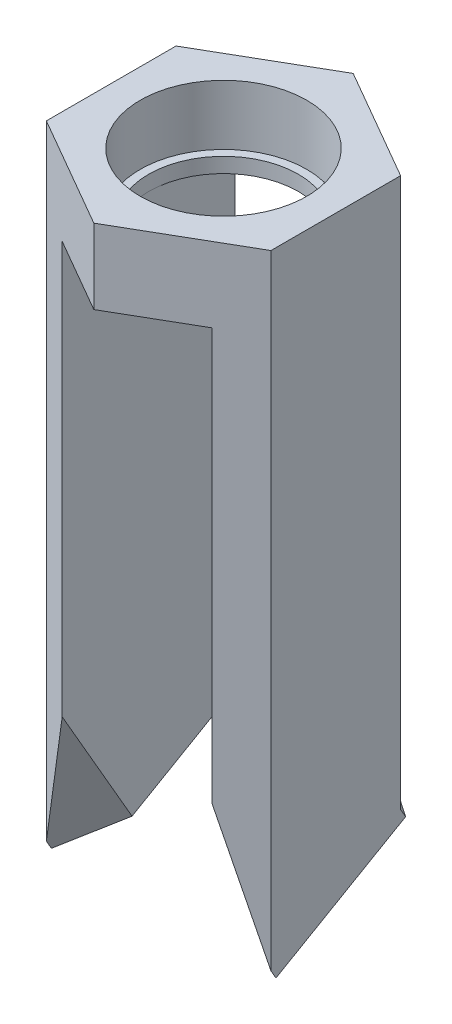
ISO-10303-21;
HEADER;
FILE_DESCRIPTION(('STEP AP214'),'2;1');
FILE_NAME('part.step','',(''),(''),'','','');
FILE_SCHEMA(('AUTOMOTIVE_DESIGN { 1 0 10303 214 1 1 1 1 }'));
ENDSEC;
DATA;
#1=APPLICATION_CONTEXT('core data for automotive mechanical design processes');
#2=APPLICATION_PROTOCOL_DEFINITION('international standard','automotive_design',2000,#1);
#3=PRODUCT_CONTEXT('',#1,'mechanical');
#4=PRODUCT('Part','Part','',(#3));
#5=PRODUCT_RELATED_PRODUCT_CATEGORY('part','',(#4));
#6=PRODUCT_DEFINITION_FORMATION('','',#4);
#7=PRODUCT_DEFINITION_CONTEXT('part definition',#1,'design');
#8=PRODUCT_DEFINITION('design','',#6,#7);
#9=PRODUCT_DEFINITION_SHAPE('','',#8);
#10=(LENGTH_UNIT() NAMED_UNIT(*) SI_UNIT(.MILLI.,.METRE.));
#11=(NAMED_UNIT(*) PLANE_ANGLE_UNIT() SI_UNIT($,.RADIAN.));
#12=(NAMED_UNIT(*) SI_UNIT($,.STERADIAN.) SOLID_ANGLE_UNIT());
#13=UNCERTAINTY_MEASURE_WITH_UNIT(LENGTH_MEASURE(1.E-05),#10,'distance_accuracy_value','');
#14=(GEOMETRIC_REPRESENTATION_CONTEXT(3) GLOBAL_UNCERTAINTY_ASSIGNED_CONTEXT((#13)) GLOBAL_UNIT_ASSIGNED_CONTEXT((#10,
#11,#12)) REPRESENTATION_CONTEXT('',''));
#15=CARTESIAN_POINT('',(0.,0.,0.));
#16=DIRECTION('',(0.,0.,1.));
#17=DIRECTION('',(1.,0.,0.));
#18=AXIS2_PLACEMENT_3D('',#15,#16,#17);
#19=CARTESIAN_POINT('',(0.,-2.,0.));
#20=DIRECTION('',(0.,-1.,0.));
#21=DIRECTION('',(0.,0.,-1.));
#22=AXIS2_PLACEMENT_3D('',#19,#20,#21);
#23=PLANE('',#22);
#24=DIRECTION('',(0.,0.,1.));
#25=VECTOR('',#24,1.);
#26=CARTESIAN_POINT('',(-10.,-2.,-11.5470053837926));
#27=LINE('',#26,#25);
#28=CARTESIAN_POINT('',(-10.,-2.,-11.5470053837926));
#29=VERTEX_POINT('',#28);
#30=CARTESIAN_POINT('',(-10.,-2.,0.));
#31=VERTEX_POINT('',#30);
#32=EDGE_CURVE('E56',#29,#31,#27,.T.);
#33=ORIENTED_EDGE('',*,*,#32,.F.);
#34=DIRECTION('',(0.866025403784439,0.,-0.5));
#35=VECTOR('',#34,1.);
#36=CARTESIAN_POINT('',(-15.0000000000001,-2.,-8.66025403784444));
#37=LINE('',#36,#35);
#38=CARTESIAN_POINT('',(0.,-2.,-17.3205080756889));
#39=VERTEX_POINT('',#38);
#40=EDGE_CURVE('E260',#29,#39,#37,.T.);
#41=ORIENTED_EDGE('',*,*,#40,.T.);
#42=DIRECTION('',(0.866025403784438,0.,0.5));
#43=VECTOR('',#42,1.);
#44=CARTESIAN_POINT('',(0.,-2.,-17.3205080756889));
#45=LINE('',#44,#43);
#46=CARTESIAN_POINT('',(10.,-2.,-11.5470053837926));
#47=VERTEX_POINT('',#46);
#48=EDGE_CURVE('E263',#39,#47,#45,.T.);
#49=ORIENTED_EDGE('',*,*,#48,.T.);
#50=DIRECTION('',(0.,0.,-1.));
#51=VECTOR('',#50,1.);
#52=CARTESIAN_POINT('',(10.,-2.,11.5470053837926));
#53=LINE('',#52,#51);
#54=CARTESIAN_POINT('',(10.,-2.,0.));
#55=VERTEX_POINT('',#54);
#56=EDGE_CURVE('E54',#55,#47,#53,.T.);
#57=ORIENTED_EDGE('',*,*,#56,.F.);
#58=CARTESIAN_POINT('',(0.,-2.,0.));
#59=DIRECTION('',(0.,-1.,0.));
#60=DIRECTION('',(0.,0.,-1.));
#61=AXIS2_PLACEMENT_3D('',#58,#59,#60);
#62=CIRCLE('',#61,10.);
#63=EDGE_CURVE('E251',#31,#55,#62,.T.);
#64=ORIENTED_EDGE('',*,*,#63,.F.);
#65=EDGE_LOOP('',(#33,#41,#49,#57,#64));
#66=FACE_BOUND('',#65,.T.);
#67=ADVANCED_FACE('F44',(#66),#23,.T.);
#68=CARTESIAN_POINT('',(0.,8.,0.));
#69=DIRECTION('',(0.,1.,0.));
#70=DIRECTION('',(0.,0.,1.));
#71=AXIS2_PLACEMENT_3D('',#68,#69,#70);
#72=PLANE('',#71);
#73=DIRECTION('',(-0.866025403784441,0.,-0.499999999999995));
#74=VECTOR('',#73,1.);
#75=CARTESIAN_POINT('',(14.9999999999999,8.,-8.66025403784456));
#76=LINE('',#75,#74);
#77=CARTESIAN_POINT('',(14.9999999999999,8.,-8.66025403784456));
#78=VERTEX_POINT('',#77);
#79=CARTESIAN_POINT('',(0.,8.,-17.3205080756888));
#80=VERTEX_POINT('',#79);
#81=EDGE_CURVE('E272',#78,#80,#76,.T.);
#82=ORIENTED_EDGE('',*,*,#81,.T.);
#83=DIRECTION('',(-0.866025403784438,0.,0.500000000000001));
#84=VECTOR('',#83,1.);
#85=CARTESIAN_POINT('',(0.,8.,-17.3205080756888));
#86=LINE('',#85,#84);
#87=CARTESIAN_POINT('',(-15.,8.,-8.66025403784436));
#88=VERTEX_POINT('',#87);
#89=EDGE_CURVE('E279',#80,#88,#86,.T.);
#90=ORIENTED_EDGE('',*,*,#89,.T.);
#91=DIRECTION('',(0.,0.,1.));
#92=VECTOR('',#91,1.);
#93=CARTESIAN_POINT('',(-15.,8.,-8.66025403784436));
#94=LINE('',#93,#92);
#95=CARTESIAN_POINT('',(-15.,8.,8.66025403784446));
#96=VERTEX_POINT('',#95);
#97=EDGE_CURVE('E282',#88,#96,#94,.T.);
#98=ORIENTED_EDGE('',*,*,#97,.T.);
#99=DIRECTION('',(0.866025403784442,0.,0.499999999999995));
#100=VECTOR('',#99,1.);
#101=CARTESIAN_POINT('',(-15.,8.,8.66025403784446));
#102=LINE('',#101,#100);
#103=CARTESIAN_POINT('',(1.20948461451098E-13,8.,17.3205080756888));
#104=VERTEX_POINT('',#103);
#105=EDGE_CURVE('E285',#96,#104,#102,.T.);
#106=ORIENTED_EDGE('',*,*,#105,.T.);
#107=DIRECTION('',(0.866025403784435,0.,-0.500000000000007));
#108=VECTOR('',#107,1.);
#109=CARTESIAN_POINT('',(1.20948461451098E-13,8.,17.3205080756888));
#110=LINE('',#109,#108);
#111=CARTESIAN_POINT('',(15.0000000000001,8.,8.66025403784425));
#112=VERTEX_POINT('',#111);
#113=EDGE_CURVE('E288',#104,#112,#110,.T.);
#114=ORIENTED_EDGE('',*,*,#113,.T.);
#115=DIRECTION('',(0.,0.,-1.));
#116=VECTOR('',#115,1.);
#117=CARTESIAN_POINT('',(15.0000000000001,8.,8.66025403784425));
#118=LINE('',#117,#116);
#119=EDGE_CURVE('E291',#112,#78,#118,.T.);
#120=ORIENTED_EDGE('',*,*,#119,.T.);
#121=EDGE_LOOP('',(#82,#90,#98,#106,#114,#120));
#122=FACE_BOUND('',#121,.T.);
#123=CARTESIAN_POINT('',(0.,8.,0.));
#124=DIRECTION('',(0.,1.,0.));
#125=DIRECTION('',(0.,0.,1.));
#126=AXIS2_PLACEMENT_3D('',#123,#124,#125);
#127=CIRCLE('',#126,11.125);
#128=CARTESIAN_POINT('',(0.,8.,11.125));
#129=VERTEX_POINT('',#128);
#130=EDGE_CURVE('E268',#129,#129,#127,.T.);
#131=ORIENTED_EDGE('',*,*,#130,.F.);
#132=EDGE_LOOP('',(#131));
#133=FACE_BOUND('',#132,.T.);
#134=ADVANCED_FACE('F357',(#122,#133),#72,.T.);
#135=CARTESIAN_POINT('',(14.9999999999999,8.,-8.66025403784456));
#136=DIRECTION('',(-0.499999999999995,0.,0.866025403784441));
#137=DIRECTION('',(0.866025403784442,0.,0.499999999999995));
#138=AXIS2_PLACEMENT_3D('',#135,#136,#137);
#139=PLANE('',#138);
#140=DIRECTION('',(0.,-1.,0.));
#141=VECTOR('',#140,1.);
#142=CARTESIAN_POINT('',(14.9999999999999,8.,-8.66025403784456));
#143=LINE('',#142,#141);
#144=CARTESIAN_POINT('',(15.0000000000001,-65.3333333333335,-8.66025403784456));
#145=VERTEX_POINT('',#144);
#146=EDGE_CURVE('E294',#78,#145,#143,.T.);
#147=ORIENTED_EDGE('',*,*,#146,.T.);
#148=DIRECTION('',(-0.832050294337848,0.277350098112608,-0.480384461415258));
#149=VECTOR('',#148,1.);
#150=CARTESIAN_POINT('',(-1.92307692307671,-59.6923076923081,-18.4307970548995));
#151=LINE('',#150,#149);
#152=CARTESIAN_POINT('',(10.,-63.6666666666669,-11.5470053837927));
#153=VERTEX_POINT('',#152);
#154=EDGE_CURVE('E224',#145,#153,#151,.T.);
#155=ORIENTED_EDGE('',*,*,#154,.T.);
#156=DIRECTION('',(0.,1.,0.));
#157=VECTOR('',#156,1.);
#158=CARTESIAN_POINT('',(10.,-77.,-11.5470053837926));
#159=LINE('',#158,#157);
#160=EDGE_CURVE('E240',#153,#47,#159,.T.);
#161=ORIENTED_EDGE('',*,*,#160,.T.);
#162=ORIENTED_EDGE('',*,*,#48,.F.);
#163=DIRECTION('',(0.,-1.,0.));
#164=VECTOR('',#163,1.);
#165=CARTESIAN_POINT('',(0.,8.,-17.3205080756888));
#166=LINE('',#165,#164);
#167=EDGE_CURVE('E48',#80,#39,#166,.T.);
#168=ORIENTED_EDGE('',*,*,#167,.F.);
#169=ORIENTED_EDGE('',*,*,#81,.F.);
#170=EDGE_LOOP('',(#147,#155,#161,#162,#168,#169));
#171=FACE_BOUND('',#170,.T.);
#172=ADVANCED_FACE('F46',(#171),#139,.F.);
#173=CARTESIAN_POINT('',(0.,8.,-17.3205080756888));
#174=DIRECTION('',(0.500000000000001,0.,0.866025403784438));
#175=DIRECTION('',(0.866025403784438,0.,-0.500000000000001));
#176=AXIS2_PLACEMENT_3D('',#173,#174,#175);
#177=PLANE('',#176);
#178=DIRECTION('',(0.,1.,0.));
#179=VECTOR('',#178,1.);
#180=CARTESIAN_POINT('',(-10.,-77.,-11.5470053837926));
#181=LINE('',#180,#179);
#182=CARTESIAN_POINT('',(-10.,-63.6666666666669,-11.5470053837926));
#183=VERTEX_POINT('',#182);
#184=EDGE_CURVE('E234',#183,#29,#181,.T.);
#185=ORIENTED_EDGE('',*,*,#184,.F.);
#186=DIRECTION('',(-0.832050294337845,-0.277350098112608,0.480384461415263));
#187=VECTOR('',#186,1.);
#188=CARTESIAN_POINT('',(15.7692307692305,-55.0769230769237,-26.4248777052173));
#189=LINE('',#188,#187);
#190=CARTESIAN_POINT('',(-15.,-65.3333333333335,-8.66025403784445));
#191=VERTEX_POINT('',#190);
#192=EDGE_CURVE('E204',#183,#191,#189,.T.);
#193=ORIENTED_EDGE('',*,*,#192,.T.);
#194=DIRECTION('',(0.,-1.,0.));
#195=VECTOR('',#194,1.);
#196=CARTESIAN_POINT('',(-15.,8.,-8.66025403784436));
#197=LINE('',#196,#195);
#198=EDGE_CURVE('E309',#88,#191,#197,.T.);
#199=ORIENTED_EDGE('',*,*,#198,.F.);
#200=ORIENTED_EDGE('',*,*,#89,.F.);
#201=ORIENTED_EDGE('',*,*,#167,.T.);
#202=ORIENTED_EDGE('',*,*,#40,.F.);
#203=EDGE_LOOP('',(#185,#193,#199,#200,#201,#202));
#204=FACE_BOUND('',#203,.T.);
#205=ADVANCED_FACE('F351',(#204),#177,.F.);
#206=CARTESIAN_POINT('',(-15.,8.,-8.66025403784436));
#207=DIRECTION('',(1.,0.,0.));
#208=DIRECTION('',(0.,0.,-1.));
#209=AXIS2_PLACEMENT_3D('',#206,#207,#208);
#210=PLANE('',#209);
#211=ORIENTED_EDGE('',*,*,#198,.T.);
#212=DIRECTION('',(0.,0.866025403784444,0.499999999999991));
#213=VECTOR('',#212,1.);
#214=CARTESIAN_POINT('',(-15.,-66.4938073744047,-9.33025403784444));
#215=LINE('',#214,#213);
#216=CARTESIAN_POINT('',(-15.,-66.4938073744047,-9.33025403784444));
#217=VERTEX_POINT('',#216);
#218=EDGE_CURVE('E199',#217,#191,#215,.T.);
#219=ORIENTED_EDGE('',*,*,#218,.F.);
#220=DIRECTION('',(0.,0.499999999999991,-0.866025403784444));
#221=VECTOR('',#220,1.);
#222=CARTESIAN_POINT('',(-15.,-76.4938073744045,7.99025403784447));
#223=LINE('',#222,#221);
#224=CARTESIAN_POINT('',(-15.,-76.4938073744045,7.99025403784447));
#225=VERTEX_POINT('',#224);
#226=EDGE_CURVE('E182',#225,#217,#223,.T.);
#227=ORIENTED_EDGE('',*,*,#226,.F.);
#228=DIRECTION('',(0.,0.866025403784444,0.499999999999991));
#229=VECTOR('',#228,1.);
#230=CARTESIAN_POINT('',(-15.,-76.4938073744045,7.99025403784447));
#231=LINE('',#230,#229);
#232=CARTESIAN_POINT('',(-15.,-75.3333333333334,8.66025403784447));
#233=VERTEX_POINT('',#232);
#234=EDGE_CURVE('E160',#225,#233,#231,.T.);
#235=ORIENTED_EDGE('',*,*,#234,.T.);
#236=DIRECTION('',(0.,-1.,0.));
#237=VECTOR('',#236,1.);
#238=CARTESIAN_POINT('',(-15.,8.,8.66025403784446));
#239=LINE('',#238,#237);
#240=EDGE_CURVE('E306',#96,#233,#239,.T.);
#241=ORIENTED_EDGE('',*,*,#240,.F.);
#242=ORIENTED_EDGE('',*,*,#97,.F.);
#243=EDGE_LOOP('',(#211,#219,#227,#235,#241,#242));
#244=FACE_BOUND('',#243,.T.);
#245=ADVANCED_FACE('F354',(#244),#210,.F.);
#246=CARTESIAN_POINT('',(-15.,8.,8.66025403784446));
#247=DIRECTION('',(0.499999999999995,0.,-0.866025403784442));
#248=DIRECTION('',(-0.866025403784442,0.,-0.499999999999995));
#249=AXIS2_PLACEMENT_3D('',#246,#247,#248);
#250=PLANE('',#249);
#251=ORIENTED_EDGE('',*,*,#240,.T.);
#252=DIRECTION('',(0.260132990857232,0.953820966476534,0.150187852296523));
#253=VECTOR('',#252,1.);
#254=CARTESIAN_POINT('',(5.67669172932306,0.481203007519083,20.5979475737199));
#255=LINE('',#254,#253);
#256=CARTESIAN_POINT('',(-10.,-56.9999999999997,11.5470053837926));
#257=VERTEX_POINT('',#256);
#258=EDGE_CURVE('E175',#233,#257,#255,.T.);
#259=ORIENTED_EDGE('',*,*,#258,.T.);
#260=DIRECTION('',(0.,1.,0.));
#261=VECTOR('',#260,1.);
#262=CARTESIAN_POINT('',(-10.,-77.,11.5470053837926));
#263=LINE('',#262,#261);
#264=CARTESIAN_POINT('',(-10.,-2.,11.5470053837926));
#265=VERTEX_POINT('',#264);
#266=EDGE_CURVE('E173',#257,#265,#263,.T.);
#267=ORIENTED_EDGE('',*,*,#266,.T.);
#268=DIRECTION('',(-0.866025403784439,0.,-0.5));
#269=VECTOR('',#268,1.);
#270=CARTESIAN_POINT('',(0.,-2.,17.3205080756889));
#271=LINE('',#270,#269);
#272=CARTESIAN_POINT('',(0.,-2.,17.3205080756889));
#273=VERTEX_POINT('',#272);
#274=EDGE_CURVE('E257',#273,#265,#271,.T.);
#275=ORIENTED_EDGE('',*,*,#274,.F.);
#276=DIRECTION('',(0.,-1.,0.));
#277=VECTOR('',#276,1.);
#278=CARTESIAN_POINT('',(1.20948461451098E-13,8.,17.3205080756888));
#279=LINE('',#278,#277);
#280=EDGE_CURVE('E302',#104,#273,#279,.T.);
#281=ORIENTED_EDGE('',*,*,#280,.F.);
#282=ORIENTED_EDGE('',*,*,#105,.F.);
#283=EDGE_LOOP('',(#251,#259,#267,#275,#281,#282));
#284=FACE_BOUND('',#283,.T.);
#285=ADVANCED_FACE('F349',(#284),#250,.F.);
#286=CARTESIAN_POINT('',(1.20948461451098E-13,8.,17.3205080756888));
#287=DIRECTION('',(-0.500000000000007,0.,-0.866025403784434));
#288=DIRECTION('',(-0.866025403784435,0.,0.500000000000007));
#289=AXIS2_PLACEMENT_3D('',#286,#287,#288);
#290=PLANE('',#289);
#291=DIRECTION('',(0.,1.,0.));
#292=VECTOR('',#291,1.);
#293=CARTESIAN_POINT('',(10.,-77.,11.5470053837926));
#294=LINE('',#293,#292);
#295=CARTESIAN_POINT('',(10.,-56.9999999999997,11.5470053837926));
#296=VERTEX_POINT('',#295);
#297=CARTESIAN_POINT('',(10.,-2.,11.5470053837926));
#298=VERTEX_POINT('',#297);
#299=EDGE_CURVE('E227',#296,#298,#294,.T.);
#300=ORIENTED_EDGE('',*,*,#299,.F.);
#301=DIRECTION('',(0.260132990857236,-0.953820966476531,-0.150187852296531));
#302=VECTOR('',#301,1.);
#303=CARTESIAN_POINT('',(-7.03007518796991,5.44360902255633,21.3793238778867));
#304=LINE('',#303,#302);
#305=CARTESIAN_POINT('',(15.0000000000002,-75.3333333333334,8.66025403784445));
#306=VERTEX_POINT('',#305);
#307=EDGE_CURVE('E191',#296,#306,#304,.T.);
#308=ORIENTED_EDGE('',*,*,#307,.T.);
#309=DIRECTION('',(0.,-1.,0.));
#310=VECTOR('',#309,1.);
#311=CARTESIAN_POINT('',(15.0000000000001,8.,8.66025403784425));
#312=LINE('',#311,#310);
#313=EDGE_CURVE('E298',#112,#306,#312,.T.);
#314=ORIENTED_EDGE('',*,*,#313,.F.);
#315=ORIENTED_EDGE('',*,*,#113,.F.);
#316=ORIENTED_EDGE('',*,*,#280,.T.);
#317=DIRECTION('',(-0.866025403784439,0.,0.5));
#318=VECTOR('',#317,1.);
#319=CARTESIAN_POINT('',(15.0000000000001,-2.,8.66025403784445));
#320=LINE('',#319,#318);
#321=EDGE_CURVE('E250',#298,#273,#320,.T.);
#322=ORIENTED_EDGE('',*,*,#321,.F.);
#323=EDGE_LOOP('',(#300,#308,#314,#315,#316,#322));
#324=FACE_BOUND('',#323,.T.);
#325=ADVANCED_FACE('F341',(#324),#290,.F.);
#326=CARTESIAN_POINT('',(15.0000000000001,8.,8.66025403784425));
#327=DIRECTION('',(-1.,0.,0.));
#328=DIRECTION('',(0.,0.,1.));
#329=AXIS2_PLACEMENT_3D('',#326,#327,#328);
#330=PLANE('',#329);
#331=ORIENTED_EDGE('',*,*,#313,.T.);
#332=DIRECTION('',(0.,0.866025403784444,0.499999999999991));
#333=VECTOR('',#332,1.);
#334=CARTESIAN_POINT('',(15.0000000000002,-76.4938073744046,7.99025403784445));
#335=LINE('',#334,#333);
#336=CARTESIAN_POINT('',(15.0000000000002,-76.4938073744046,7.99025403784447));
#337=VERTEX_POINT('',#336);
#338=EDGE_CURVE('E212',#337,#306,#335,.T.);
#339=ORIENTED_EDGE('',*,*,#338,.F.);
#340=DIRECTION('',(0.,-0.499999999999992,0.866025403784443));
#341=VECTOR('',#340,1.);
#342=CARTESIAN_POINT('',(15.0000000000002,-76.4938073744046,7.99025403784445));
#343=LINE('',#342,#341);
#344=CARTESIAN_POINT('',(15.0000000000001,-66.4938073744047,-9.33025403784455));
#345=VERTEX_POINT('',#344);
#346=EDGE_CURVE('E215',#345,#337,#343,.T.);
#347=ORIENTED_EDGE('',*,*,#346,.F.);
#348=DIRECTION('',(0.,0.866025403784444,0.499999999999991));
#349=VECTOR('',#348,1.);
#350=CARTESIAN_POINT('',(15.0000000000001,-66.4938073744047,-9.33025403784455));
#351=LINE('',#350,#349);
#352=EDGE_CURVE('E208',#345,#145,#351,.T.);
#353=ORIENTED_EDGE('',*,*,#352,.T.);
#354=ORIENTED_EDGE('',*,*,#146,.F.);
#355=ORIENTED_EDGE('',*,*,#119,.F.);
#356=EDGE_LOOP('',(#331,#339,#347,#353,#354,#355));
#357=FACE_BOUND('',#356,.T.);
#358=ADVANCED_FACE('F369',(#357),#330,.F.);
#359=CARTESIAN_POINT('',(0.,8.,0.));
#360=DIRECTION('',(0.,-1.,0.));
#361=DIRECTION('',(0.,0.,-1.));
#362=AXIS2_PLACEMENT_3D('',#359,#360,#361);
#363=CYLINDRICAL_SURFACE('',#362,11.125);
#364=ORIENTED_EDGE('',*,*,#130,.T.);
#365=EDGE_LOOP('',(#364));
#366=FACE_BOUND('',#365,.T.);
#367=CARTESIAN_POINT('',(0.,0.,0.));
#368=DIRECTION('',(0.,1.,0.));
#369=DIRECTION('',(0.,0.,1.));
#370=AXIS2_PLACEMENT_3D('',#367,#368,#369);
#371=CIRCLE('',#370,11.125);
#372=CARTESIAN_POINT('',(0.,0.,11.125));
#373=VERTEX_POINT('',#372);
#374=EDGE_CURVE('E267',#373,#373,#371,.T.);
#375=ORIENTED_EDGE('',*,*,#374,.F.);
#376=EDGE_LOOP('',(#375));
#377=FACE_BOUND('',#376,.T.);
#378=ADVANCED_FACE('F412',(#366,#377),#363,.F.);
#379=CARTESIAN_POINT('',(0.,0.,0.));
#380=DIRECTION('',(0.,-1.,0.));
#381=DIRECTION('',(0.,0.,-1.));
#382=AXIS2_PLACEMENT_3D('',#379,#380,#381);
#383=PLANE('',#382);
#384=CARTESIAN_POINT('',(0.,0.,0.));
#385=DIRECTION('',(0.,-1.,0.));
#386=DIRECTION('',(0.,0.,-1.));
#387=AXIS2_PLACEMENT_3D('',#384,#385,#386);
#388=CIRCLE('',#387,10.);
#389=CARTESIAN_POINT('',(0.,0.,-10.));
#390=VERTEX_POINT('',#389);
#391=EDGE_CURVE('E237',#390,#390,#388,.T.);
#392=ORIENTED_EDGE('',*,*,#391,.T.);
#393=EDGE_LOOP('',(#392));
#394=FACE_BOUND('',#393,.T.);
#395=ORIENTED_EDGE('',*,*,#374,.T.);
#396=EDGE_LOOP('',(#395));
#397=FACE_BOUND('',#396,.T.);
#398=ADVANCED_FACE('F408',(#394,#397),#383,.F.);
#399=EDGE_CURVE('E11',#31,#265,#27,.T.);
#400=ORIENTED_EDGE('',*,*,#399,.F.);
#401=EDGE_CURVE('E246',#55,#31,#62,.T.);
#402=ORIENTED_EDGE('',*,*,#401,.F.);
#403=EDGE_CURVE('E231',#298,#55,#53,.T.);
#404=ORIENTED_EDGE('',*,*,#403,.F.);
#405=ORIENTED_EDGE('',*,*,#321,.T.);
#406=ORIENTED_EDGE('',*,*,#274,.T.);
#407=EDGE_LOOP('',(#400,#402,#404,#405,#406));
#408=FACE_BOUND('',#407,.T.);
#409=ADVANCED_FACE('F337',(#408),#23,.T.);
#410=CARTESIAN_POINT('',(0.,-2.,0.));
#411=DIRECTION('',(0.,1.,0.));
#412=DIRECTION('',(0.,0.,1.));
#413=AXIS2_PLACEMENT_3D('',#410,#411,#412);
#414=CYLINDRICAL_SURFACE('',#413,10.);
#415=ORIENTED_EDGE('',*,*,#401,.T.);
#416=ORIENTED_EDGE('',*,*,#63,.T.);
#417=EDGE_LOOP('',(#415,#416));
#418=FACE_BOUND('',#417,.T.);
#419=ORIENTED_EDGE('',*,*,#391,.F.);
#420=EDGE_LOOP('',(#419));
#421=FACE_BOUND('',#420,.T.);
#422=ADVANCED_FACE('F334',(#418,#421),#414,.F.);
#423=CARTESIAN_POINT('',(10.,-77.,11.5470053837926));
#424=DIRECTION('',(1.,0.,0.));
#425=DIRECTION('',(0.,0.,-1.));
#426=AXIS2_PLACEMENT_3D('',#423,#424,#425);
#427=PLANE('',#426);
#428=DIRECTION('',(0.,0.499999999999991,-0.866025403784444));
#429=VECTOR('',#428,1.);
#430=CARTESIAN_POINT('',(10.,-64.827140707738,-12.2170053837927));
#431=LINE('',#430,#429);
#432=CARTESIAN_POINT('',(10.,-73.1604740410713,2.21675134594818));
#433=VERTEX_POINT('',#432);
#434=CARTESIAN_POINT('',(10.,-64.827140707738,-12.2170053837927));
#435=VERTEX_POINT('',#434);
#436=EDGE_CURVE('E183',#433,#435,#431,.T.);
#437=ORIENTED_EDGE('',*,*,#436,.F.);
#438=DIRECTION('',(0.,-0.866025403784443,-0.499999999999992));
#439=VECTOR('',#438,1.);
#440=CARTESIAN_POINT('',(10.,-5.74999999999939,41.1362066797604));
#441=LINE('',#440,#439);
#442=EDGE_CURVE('E63',#296,#433,#441,.T.);
#443=ORIENTED_EDGE('',*,*,#442,.F.);
#444=ORIENTED_EDGE('',*,*,#299,.T.);
#445=ORIENTED_EDGE('',*,*,#403,.T.);
#446=ORIENTED_EDGE('',*,*,#56,.T.);
#447=ORIENTED_EDGE('',*,*,#160,.F.);
#448=DIRECTION('',(0.,0.866025403784444,0.499999999999991));
#449=VECTOR('',#448,1.);
#450=CARTESIAN_POINT('',(10.,-64.827140707738,-12.2170053837927));
#451=LINE('',#450,#449);
#452=EDGE_CURVE('E205',#435,#153,#451,.T.);
#453=ORIENTED_EDGE('',*,*,#452,.F.);
#454=EDGE_LOOP('',(#437,#443,#444,#445,#446,#447,#453));
#455=FACE_BOUND('',#454,.T.);
#456=ADVANCED_FACE('F327',(#455),#427,.F.);
#457=CARTESIAN_POINT('',(-10.,-77.,-11.5470053837926));
#458=DIRECTION('',(-1.,0.,0.));
#459=DIRECTION('',(0.,0.,1.));
#460=AXIS2_PLACEMENT_3D('',#457,#458,#459);
#461=PLANE('',#460);
#462=ORIENTED_EDGE('',*,*,#266,.F.);
#463=DIRECTION('',(0.,-0.866025403784443,-0.499999999999992));
#464=VECTOR('',#463,1.);
#465=CARTESIAN_POINT('',(-10.,-5.74999999999939,41.1362066797604));
#466=LINE('',#465,#464);
#467=CARTESIAN_POINT('',(-10.,-73.1604740410713,2.21675134594817));
#468=VERTEX_POINT('',#467);
#469=EDGE_CURVE('E157',#257,#468,#466,.T.);
#470=ORIENTED_EDGE('',*,*,#469,.T.);
#471=DIRECTION('',(0.,-0.499999999999991,0.866025403784444));
#472=VECTOR('',#471,1.);
#473=CARTESIAN_POINT('',(-10.,-64.827140707738,-12.2170053837926));
#474=LINE('',#473,#472);
#475=CARTESIAN_POINT('',(-10.,-64.827140707738,-12.2170053837926));
#476=VERTEX_POINT('',#475);
#477=EDGE_CURVE('E172',#476,#468,#474,.T.);
#478=ORIENTED_EDGE('',*,*,#477,.F.);
#479=DIRECTION('',(0.,0.866025403784444,0.499999999999991));
#480=VECTOR('',#479,1.);
#481=CARTESIAN_POINT('',(-10.,-64.827140707738,-12.2170053837926));
#482=LINE('',#481,#480);
#483=EDGE_CURVE('E196',#476,#183,#482,.T.);
#484=ORIENTED_EDGE('',*,*,#483,.T.);
#485=ORIENTED_EDGE('',*,*,#184,.T.);
#486=ORIENTED_EDGE('',*,*,#32,.T.);
#487=ORIENTED_EDGE('',*,*,#399,.T.);
#488=EDGE_LOOP('',(#462,#470,#478,#484,#485,#486,#487));
#489=FACE_BOUND('',#488,.T.);
#490=ADVANCED_FACE('F170',(#489),#461,.F.);
#491=CARTESIAN_POINT('',(15.0000000000001,-66.4938073744047,-9.33025403784455));
#492=DIRECTION('',(-0.554700196225218,-0.416025147168917,0.720576692122903));
#493=DIRECTION('',(0.792405815693072,0.,0.609994281330405));
#494=AXIS2_PLACEMENT_3D('',#491,#492,#493);
#495=PLANE('',#494);
#496=ORIENTED_EDGE('',*,*,#154,.F.);
#497=ORIENTED_EDGE('',*,*,#352,.F.);
#498=DIRECTION('',(0.832050294337851,-0.277350098112605,0.480384461415254));
#499=VECTOR('',#498,1.);
#500=CARTESIAN_POINT('',(15.0000000000001,-66.4938073744047,-9.33025403784455));
#501=LINE('',#500,#499);
#502=EDGE_CURVE('E188',#435,#345,#501,.T.);
#503=ORIENTED_EDGE('',*,*,#502,.F.);
#504=ORIENTED_EDGE('',*,*,#452,.T.);
#505=EDGE_LOOP('',(#496,#497,#503,#504));
#506=FACE_BOUND('',#505,.T.);
#507=ADVANCED_FACE('F365',(#506),#495,.F.);
#508=CARTESIAN_POINT('',(-2.44005034337639E-13,-53.9104740410719,-31.1252266997524));
#509=DIRECTION('',(0.,0.866025403784444,0.499999999999991));
#510=DIRECTION('',(0.,-0.499999999999991,0.866025403784444));
#511=AXIS2_PLACEMENT_3D('',#508,#509,#510);
#512=PLANE('',#511);
#513=CARTESIAN_POINT('',(12.4986020751402,-72.4845227332736,1.04596933739967));
#514=DIRECTION('',(0.,-0.866025403784443,-0.499999999999992));
#515=DIRECTION('',(0.,0.499999999999992,-0.866025403784443));
#516=AXIS2_PLACEMENT_3D('',#513,#514,#515);
#517=CIRCLE('',#516,1.50000000000001);
#518=CARTESIAN_POINT('',(12.4986020751402,-71.7345227332736,-0.253068768277002));
#519=VERTEX_POINT('',#518);
#520=EDGE_CURVE('E586',#519,#519,#517,.T.);
#521=ORIENTED_EDGE('',*,*,#520,.F.);
#522=EDGE_LOOP('',(#521));
#523=FACE_BOUND('',#522,.T.);
#524=CARTESIAN_POINT('',(12.4986020751401,-67.7006170727539,-7.23999832523691));
#525=DIRECTION('',(0.,-0.866025403784443,-0.499999999999992));
#526=DIRECTION('',(0.,0.499999999999992,-0.866025403784443));
#527=AXIS2_PLACEMENT_3D('',#524,#525,#526);
#528=CIRCLE('',#527,1.5);
#529=CARTESIAN_POINT('',(12.4986020751401,-66.9506170727539,-8.53903643091357));
#530=VERTEX_POINT('',#529);
#531=EDGE_CURVE('E607',#530,#530,#528,.T.);
#532=ORIENTED_EDGE('',*,*,#531,.F.);
#533=EDGE_LOOP('',(#532));
#534=FACE_BOUND('',#533,.T.);
#535=ORIENTED_EDGE('',*,*,#346,.T.);
#536=DIRECTION('',(0.600000000000013,-0.399999999999987,0.692820323027547));
#537=VECTOR('',#536,1.);
#538=CARTESIAN_POINT('',(10.,-73.1604740410713,2.21675134594817));
#539=LINE('',#538,#537);
#540=EDGE_CURVE('E165',#433,#337,#539,.T.);
#541=ORIENTED_EDGE('',*,*,#540,.F.);
#542=ORIENTED_EDGE('',*,*,#436,.T.);
#543=ORIENTED_EDGE('',*,*,#502,.T.);
#544=EDGE_LOOP('',(#535,#541,#542,#543));
#545=FACE_BOUND('',#544,.T.);
#546=ADVANCED_FACE('F372',(#523,#534,#545),#512,.F.);
#547=CARTESIAN_POINT('',(-15.,-66.4938073744047,-9.33025403784444));
#548=DIRECTION('',(0.554700196225229,-0.416025147168915,0.720576692122896));
#549=DIRECTION('',(0.792405815693063,0.,-0.609994281330416));
#550=AXIS2_PLACEMENT_3D('',#547,#548,#549);
#551=PLANE('',#550);
#552=ORIENTED_EDGE('',*,*,#192,.F.);
#553=ORIENTED_EDGE('',*,*,#483,.F.);
#554=DIRECTION('',(0.832050294337844,0.277350098112608,-0.480384461415265));
#555=VECTOR('',#554,1.);
#556=CARTESIAN_POINT('',(-15.,-66.4938073744047,-9.33025403784444));
#557=LINE('',#556,#555);
#558=EDGE_CURVE('E179',#217,#476,#557,.T.);
#559=ORIENTED_EDGE('',*,*,#558,.F.);
#560=ORIENTED_EDGE('',*,*,#218,.T.);
#561=EDGE_LOOP('',(#552,#553,#559,#560));
#562=FACE_BOUND('',#561,.T.);
#563=ADVANCED_FACE('F353',(#562),#551,.F.);
#564=CARTESIAN_POINT('',(-1.05838964269583E-13,-53.9104740410719,-31.1252266997524));
#565=DIRECTION('',(0.,-0.866025403784444,-0.499999999999991));
#566=DIRECTION('',(0.,0.499999999999991,-0.866025403784444));
#567=AXIS2_PLACEMENT_3D('',#564,#565,#566);
#568=PLANE('',#567);
#569=CARTESIAN_POINT('',(-12.4986020751406,-67.700617072754,-7.23999832523656));
#570=DIRECTION('',(0.,-0.866025403784443,-0.499999999999992));
#571=DIRECTION('',(0.,0.499999999999992,-0.866025403784443));
#572=AXIS2_PLACEMENT_3D('',#569,#570,#571);
#573=CIRCLE('',#572,1.5);
#574=CARTESIAN_POINT('',(-12.4986020751406,-66.950617072754,-8.53903643091323));
#575=VERTEX_POINT('',#574);
#576=EDGE_CURVE('E596',#575,#575,#573,.T.);
#577=ORIENTED_EDGE('',*,*,#576,.F.);
#578=EDGE_LOOP('',(#577));
#579=FACE_BOUND('',#578,.T.);
#580=CARTESIAN_POINT('',(-12.4986020751405,-71.2765947074318,-1.04622337524449));
#581=DIRECTION('',(0.,-0.866025403784443,-0.499999999999992));
#582=DIRECTION('',(0.,0.499999999999992,-0.866025403784443));
#583=AXIS2_PLACEMENT_3D('',#580,#581,#582);
#584=CIRCLE('',#583,1.50000000000001);
#585=CARTESIAN_POINT('',(-12.4986020751405,-70.5265947074318,-2.34526148092117));
#586=VERTEX_POINT('',#585);
#587=EDGE_CURVE('E380',#586,#586,#584,.T.);
#588=ORIENTED_EDGE('',*,*,#587,.F.);
#589=EDGE_LOOP('',(#588));
#590=FACE_BOUND('',#589,.T.);
#591=DIRECTION('',(0.599999999999998,0.399999999999994,-0.692820323027556));
#592=VECTOR('',#591,1.);
#593=CARTESIAN_POINT('',(-15.,-76.4938073744046,7.99025403784446));
#594=LINE('',#593,#592);
#595=EDGE_CURVE('E154',#225,#468,#594,.T.);
#596=ORIENTED_EDGE('',*,*,#595,.F.);
#597=ORIENTED_EDGE('',*,*,#226,.T.);
#598=ORIENTED_EDGE('',*,*,#558,.T.);
#599=ORIENTED_EDGE('',*,*,#477,.T.);
#600=EDGE_LOOP('',(#596,#597,#598,#599));
#601=FACE_BOUND('',#600,.T.);
#602=ADVANCED_FACE('F177',(#579,#590,#601),#568,.T.);
#603=CARTESIAN_POINT('',(-15.,-9.08333333333267,46.9097093716567));
#604=DIRECTION('',(-0.800000000000001,0.299999999999994,-0.519615242270664));
#605=DIRECTION('',(-0.544704779401922,0.,0.838627869377534));
#606=AXIS2_PLACEMENT_3D('',#603,#604,#605);
#607=PLANE('',#606);
#608=ORIENTED_EDGE('',*,*,#234,.F.);
#609=ORIENTED_EDGE('',*,*,#595,.T.);
#610=ORIENTED_EDGE('',*,*,#469,.F.);
#611=ORIENTED_EDGE('',*,*,#258,.F.);
#612=EDGE_LOOP('',(#608,#609,#610,#611));
#613=FACE_BOUND('',#612,.T.);
#614=ADVANCED_FACE('F156',(#613),#607,.F.);
#615=CARTESIAN_POINT('',(10.,-5.74999999999939,41.1362066797604));
#616=DIRECTION('',(0.79999999999999,0.300000000000002,-0.519615242270678));
#617=DIRECTION('',(-0.544704779401938,0.,-0.838627869377525));
#618=AXIS2_PLACEMENT_3D('',#615,#616,#617);
#619=PLANE('',#618);
#620=ORIENTED_EDGE('',*,*,#442,.T.);
#621=ORIENTED_EDGE('',*,*,#540,.T.);
#622=ORIENTED_EDGE('',*,*,#338,.T.);
#623=ORIENTED_EDGE('',*,*,#307,.F.);
#624=EDGE_LOOP('',(#620,#621,#622,#623));
#625=FACE_BOUND('',#624,.T.);
#626=ADVANCED_FACE('F384',(#625),#619,.F.);
#627=CARTESIAN_POINT('',(-12.4986020751404,-62.6163406695874,3.95377662475542));
#628=DIRECTION('',(0.,-0.866025403784443,-0.499999999999992));
#629=DIRECTION('',(0.,0.499999999999992,-0.866025403784443));
#630=AXIS2_PLACEMENT_3D('',#627,#628,#629);
#631=CYLINDRICAL_SURFACE('',#630,1.50000000000001);
#632=CARTESIAN_POINT('',(-12.4986020751404,-62.6163406695874,3.95377662475542));
#633=DIRECTION('',(0.,-0.866025403784443,-0.499999999999992));
#634=DIRECTION('',(0.,0.499999999999992,-0.866025403784443));
#635=AXIS2_PLACEMENT_3D('',#632,#633,#634);
#636=CIRCLE('',#635,1.50000000000001);
#637=CARTESIAN_POINT('',(-12.4986020751404,-61.8663406695874,2.65473851907875));
#638=VERTEX_POINT('',#637);
#639=EDGE_CURVE('E374',#638,#638,#636,.T.);
#640=ORIENTED_EDGE('',*,*,#639,.F.);
#641=EDGE_LOOP('',(#640));
#642=FACE_BOUND('',#641,.T.);
#643=ORIENTED_EDGE('',*,*,#587,.T.);
#644=EDGE_LOOP('',(#643));
#645=FACE_BOUND('',#644,.T.);
#646=ADVANCED_FACE('F386',(#642,#645),#631,.F.);
#647=CARTESIAN_POINT('',(-12.4986020751404,-62.6163406695874,3.95377662475542));
#648=DIRECTION('',(0.,-0.866025403784443,-0.499999999999992));
#649=DIRECTION('',(0.,0.499999999999992,-0.866025403784443));
#650=AXIS2_PLACEMENT_3D('',#647,#648,#649);
#651=PLANE('',#650);
#652=ORIENTED_EDGE('',*,*,#639,.T.);
#653=EDGE_LOOP('',(#652));
#654=FACE_BOUND('',#653,.T.);
#655=ADVANCED_FACE('F393',(#654),#651,.T.);
#656=CARTESIAN_POINT('',(-12.4986020751405,-59.0403630349096,-2.23999832523664));
#657=DIRECTION('',(0.,-0.866025403784443,-0.499999999999992));
#658=DIRECTION('',(0.,0.499999999999992,-0.866025403784443));
#659=AXIS2_PLACEMENT_3D('',#656,#657,#658);
#660=CYLINDRICAL_SURFACE('',#659,1.5);
#661=CARTESIAN_POINT('',(-12.4986020751405,-59.0403630349096,-2.23999832523664));
#662=DIRECTION('',(0.,-0.866025403784443,-0.499999999999992));
#663=DIRECTION('',(0.,0.499999999999992,-0.866025403784443));
#664=AXIS2_PLACEMENT_3D('',#661,#662,#663);
#665=CIRCLE('',#664,1.5);
#666=CARTESIAN_POINT('',(-12.4986020751405,-58.2903630349096,-3.53903643091331));
#667=VERTEX_POINT('',#666);
#668=EDGE_CURVE('E601',#667,#667,#665,.T.);
#669=ORIENTED_EDGE('',*,*,#668,.F.);
#670=EDGE_LOOP('',(#669));
#671=FACE_BOUND('',#670,.T.);
#672=ORIENTED_EDGE('',*,*,#576,.T.);
#673=EDGE_LOOP('',(#672));
#674=FACE_BOUND('',#673,.T.);
#675=ADVANCED_FACE('F515',(#671,#674),#660,.F.);
#676=CARTESIAN_POINT('',(-12.4986020751405,-59.0403630349096,-2.23999832523664));
#677=DIRECTION('',(0.,-0.866025403784443,-0.499999999999992));
#678=DIRECTION('',(0.,0.499999999999992,-0.866025403784443));
#679=AXIS2_PLACEMENT_3D('',#676,#677,#678);
#680=PLANE('',#679);
#681=ORIENTED_EDGE('',*,*,#668,.T.);
#682=EDGE_LOOP('',(#681));
#683=FACE_BOUND('',#682,.T.);
#684=ADVANCED_FACE('F524',(#683),#680,.T.);
#685=CARTESIAN_POINT('',(12.4986020751401,-59.0403630349095,-2.239998325237));
#686=DIRECTION('',(0.,-0.866025403784443,-0.499999999999992));
#687=DIRECTION('',(0.,0.499999999999992,-0.866025403784443));
#688=AXIS2_PLACEMENT_3D('',#685,#686,#687);
#689=CYLINDRICAL_SURFACE('',#688,1.5);
#690=CARTESIAN_POINT('',(12.4986020751401,-59.0403630349095,-2.239998325237));
#691=DIRECTION('',(0.,-0.866025403784443,-0.499999999999992));
#692=DIRECTION('',(0.,0.499999999999992,-0.866025403784443));
#693=AXIS2_PLACEMENT_3D('',#690,#691,#692);
#694=CIRCLE('',#693,1.5);
#695=CARTESIAN_POINT('',(12.4986020751401,-58.2903630349095,-3.53903643091366));
#696=VERTEX_POINT('',#695);
#697=EDGE_CURVE('E590',#696,#696,#694,.T.);
#698=ORIENTED_EDGE('',*,*,#697,.F.);
#699=EDGE_LOOP('',(#698));
#700=FACE_BOUND('',#699,.T.);
#701=ORIENTED_EDGE('',*,*,#531,.T.);
#702=EDGE_LOOP('',(#701));
#703=FACE_BOUND('',#702,.T.);
#704=ADVANCED_FACE('F533',(#700,#703),#689,.F.);
#705=CARTESIAN_POINT('',(12.4986020751401,-59.0403630349095,-2.239998325237));
#706=DIRECTION('',(0.,-0.866025403784443,-0.499999999999992));
#707=DIRECTION('',(0.,0.499999999999992,-0.866025403784443));
#708=AXIS2_PLACEMENT_3D('',#705,#706,#707);
#709=PLANE('',#708);
#710=ORIENTED_EDGE('',*,*,#697,.T.);
#711=EDGE_LOOP('',(#710));
#712=FACE_BOUND('',#711,.T.);
#713=ADVANCED_FACE('F542',(#712),#709,.T.);
#714=CARTESIAN_POINT('',(12.4986020751403,-63.8242686954291,6.04596933739958));
#715=DIRECTION('',(0.,-0.866025403784443,-0.499999999999992));
#716=DIRECTION('',(0.,0.499999999999992,-0.866025403784443));
#717=AXIS2_PLACEMENT_3D('',#714,#715,#716);
#718=CYLINDRICAL_SURFACE('',#717,1.50000000000001);
#719=CARTESIAN_POINT('',(12.4986020751403,-63.8242686954291,6.04596933739958));
#720=DIRECTION('',(0.,-0.866025403784443,-0.499999999999992));
#721=DIRECTION('',(0.,0.499999999999992,-0.866025403784443));
#722=AXIS2_PLACEMENT_3D('',#719,#720,#721);
#723=CIRCLE('',#722,1.50000000000001);
#724=CARTESIAN_POINT('',(12.4986020751403,-63.0742686954291,4.74693123172291));
#725=VERTEX_POINT('',#724);
#726=EDGE_CURVE('E584',#725,#725,#723,.T.);
#727=ORIENTED_EDGE('',*,*,#726,.F.);
#728=EDGE_LOOP('',(#727));
#729=FACE_BOUND('',#728,.T.);
#730=ORIENTED_EDGE('',*,*,#520,.T.);
#731=EDGE_LOOP('',(#730));
#732=FACE_BOUND('',#731,.T.);
#733=ADVANCED_FACE('F551',(#729,#732),#718,.F.);
#734=CARTESIAN_POINT('',(12.4986020751403,-63.8242686954291,6.04596933739958));
#735=DIRECTION('',(0.,-0.866025403784443,-0.499999999999992));
#736=DIRECTION('',(0.,0.499999999999992,-0.866025403784443));
#737=AXIS2_PLACEMENT_3D('',#734,#735,#736);
#738=PLANE('',#737);
#739=ORIENTED_EDGE('',*,*,#726,.T.);
#740=EDGE_LOOP('',(#739));
#741=FACE_BOUND('',#740,.T.);
#742=ADVANCED_FACE('F560',(#741),#738,.T.);
#743=CLOSED_SHELL('',(#67,#134,#172,#205,#245,#285,#325,#358,#378,#398,#409,#422,#456,#490,#507,
#546,#563,#602,#614,#626,#646,#655,#675,#684,#704,#713,#733,#742));
#744=MANIFOLD_SOLID_BREP('B2',#743);
#745=ADVANCED_BREP_SHAPE_REPRESENTATION('',(#18,#744),#14);
#746=SHAPE_DEFINITION_REPRESENTATION(#9,#745);
ENDSEC;
END-ISO-10303-21;
